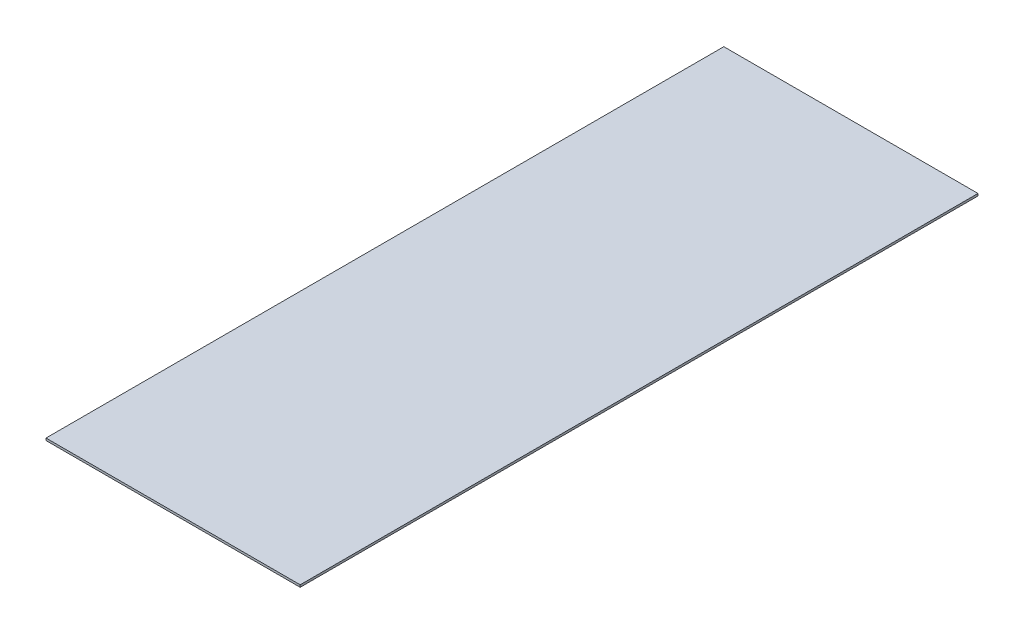
ISO-10303-21;
HEADER;
FILE_DESCRIPTION(('STEP AP214'),'2;1');
FILE_NAME('part.step','',(''),(''),'','','');
FILE_SCHEMA(('AUTOMOTIVE_DESIGN { 1 0 10303 214 1 1 1 1 }'));
ENDSEC;
DATA;
#1=APPLICATION_CONTEXT('core data for automotive mechanical design processes');
#2=APPLICATION_PROTOCOL_DEFINITION('international standard','automotive_design',2000,#1);
#3=PRODUCT_CONTEXT('',#1,'mechanical');
#4=PRODUCT('Part','Part','',(#3));
#5=PRODUCT_RELATED_PRODUCT_CATEGORY('part','',(#4));
#6=PRODUCT_DEFINITION_FORMATION('','',#4);
#7=PRODUCT_DEFINITION_CONTEXT('part definition',#1,'design');
#8=PRODUCT_DEFINITION('design','',#6,#7);
#9=PRODUCT_DEFINITION_SHAPE('','',#8);
#10=(LENGTH_UNIT() NAMED_UNIT(*) SI_UNIT(.MILLI.,.METRE.));
#11=(NAMED_UNIT(*) PLANE_ANGLE_UNIT() SI_UNIT($,.RADIAN.));
#12=(NAMED_UNIT(*) SI_UNIT($,.STERADIAN.) SOLID_ANGLE_UNIT());
#13=UNCERTAINTY_MEASURE_WITH_UNIT(LENGTH_MEASURE(1.E-05),#10,'distance_accuracy_value','');
#14=(GEOMETRIC_REPRESENTATION_CONTEXT(3) GLOBAL_UNCERTAINTY_ASSIGNED_CONTEXT((#13)) GLOBAL_UNIT_ASSIGNED_CONTEXT((#10,
#11,#12)) REPRESENTATION_CONTEXT('',''));
#15=CARTESIAN_POINT('',(0.,0.,0.));
#16=DIRECTION('',(0.,0.,1.));
#17=DIRECTION('',(1.,0.,0.));
#18=AXIS2_PLACEMENT_3D('',#15,#16,#17);
#19=CARTESIAN_POINT('',(457.2,7.9,1219.2));
#20=DIRECTION('',(-1.,0.,0.));
#21=DIRECTION('',(0.,0.,1.));
#22=AXIS2_PLACEMENT_3D('',#19,#20,#21);
#23=PLANE('',#22);
#24=DIRECTION('',(0.,0.,-1.));
#25=VECTOR('',#24,1.);
#26=CARTESIAN_POINT('',(457.2,0.,1219.2));
#27=LINE('',#26,#25);
#28=CARTESIAN_POINT('',(457.2,0.,1219.2));
#29=VERTEX_POINT('',#28);
#30=CARTESIAN_POINT('',(457.2,0.,-1219.2));
#31=VERTEX_POINT('',#30);
#32=EDGE_CURVE('E96',#29,#31,#27,.T.);
#33=ORIENTED_EDGE('',*,*,#32,.T.);
#34=DIRECTION('',(0.,-1.,0.));
#35=VECTOR('',#34,1.);
#36=CARTESIAN_POINT('',(457.2,7.9,-1219.2));
#37=LINE('',#36,#35);
#38=CARTESIAN_POINT('',(457.2,7.9,-1219.2));
#39=VERTEX_POINT('',#38);
#40=EDGE_CURVE('E11',#39,#31,#37,.T.);
#41=ORIENTED_EDGE('',*,*,#40,.F.);
#42=DIRECTION('',(0.,0.,-1.));
#43=VECTOR('',#42,1.);
#44=CARTESIAN_POINT('',(457.2,7.9,1219.2));
#45=LINE('',#44,#43);
#46=CARTESIAN_POINT('',(457.2,7.9,1219.2));
#47=VERTEX_POINT('',#46);
#48=EDGE_CURVE('E84',#47,#39,#45,.T.);
#49=ORIENTED_EDGE('',*,*,#48,.F.);
#50=DIRECTION('',(0.,-1.,0.));
#51=VECTOR('',#50,1.);
#52=CARTESIAN_POINT('',(457.2,7.9,1219.2));
#53=LINE('',#52,#51);
#54=EDGE_CURVE('E92',#47,#29,#53,.T.);
#55=ORIENTED_EDGE('',*,*,#54,.T.);
#56=EDGE_LOOP('',(#33,#41,#49,#55));
#57=FACE_BOUND('',#56,.T.);
#58=ADVANCED_FACE('F33',(#57),#23,.F.);
#59=CARTESIAN_POINT('',(-457.2,7.9,-1219.2));
#60=DIRECTION('',(0.,0.,1.));
#61=DIRECTION('',(1.,0.,0.));
#62=AXIS2_PLACEMENT_3D('',#59,#60,#61);
#63=PLANE('',#62);
#64=DIRECTION('',(-1.,0.,0.));
#65=VECTOR('',#64,1.);
#66=CARTESIAN_POINT('',(-457.2,0.,-1219.2));
#67=LINE('',#66,#65);
#68=CARTESIAN_POINT('',(-457.2,0.,-1219.2));
#69=VERTEX_POINT('',#68);
#70=EDGE_CURVE('E88',#31,#69,#67,.T.);
#71=ORIENTED_EDGE('',*,*,#70,.T.);
#72=DIRECTION('',(0.,-1.,0.));
#73=VECTOR('',#72,1.);
#74=CARTESIAN_POINT('',(-457.2,7.9,-1219.2));
#75=LINE('',#74,#73);
#76=CARTESIAN_POINT('',(-457.2,7.9,-1219.2));
#77=VERTEX_POINT('',#76);
#78=EDGE_CURVE('E41',#77,#69,#75,.T.);
#79=ORIENTED_EDGE('',*,*,#78,.F.);
#80=DIRECTION('',(-1.,0.,0.));
#81=VECTOR('',#80,1.);
#82=CARTESIAN_POINT('',(-457.2,7.9,-1219.2));
#83=LINE('',#82,#81);
#84=EDGE_CURVE('E79',#39,#77,#83,.T.);
#85=ORIENTED_EDGE('',*,*,#84,.F.);
#86=ORIENTED_EDGE('',*,*,#40,.T.);
#87=EDGE_LOOP('',(#71,#79,#85,#86));
#88=FACE_BOUND('',#87,.T.);
#89=ADVANCED_FACE('F87',(#88),#63,.F.);
#90=CARTESIAN_POINT('',(-457.2,7.9,1219.2));
#91=DIRECTION('',(1.,0.,0.));
#92=DIRECTION('',(0.,0.,-1.));
#93=AXIS2_PLACEMENT_3D('',#90,#91,#92);
#94=PLANE('',#93);
#95=DIRECTION('',(0.,0.,1.));
#96=VECTOR('',#95,1.);
#97=CARTESIAN_POINT('',(-457.2,0.,1219.2));
#98=LINE('',#97,#96);
#99=CARTESIAN_POINT('',(-457.2,0.,1219.2));
#100=VERTEX_POINT('',#99);
#101=EDGE_CURVE('E66',#69,#100,#98,.T.);
#102=ORIENTED_EDGE('',*,*,#101,.T.);
#103=DIRECTION('',(0.,-1.,0.));
#104=VECTOR('',#103,1.);
#105=CARTESIAN_POINT('',(-457.2,7.9,1219.2));
#106=LINE('',#105,#104);
#107=CARTESIAN_POINT('',(-457.2,7.9,1219.2));
#108=VERTEX_POINT('',#107);
#109=EDGE_CURVE('E89',#108,#100,#106,.T.);
#110=ORIENTED_EDGE('',*,*,#109,.F.);
#111=DIRECTION('',(0.,0.,1.));
#112=VECTOR('',#111,1.);
#113=CARTESIAN_POINT('',(-457.2,7.9,1219.2));
#114=LINE('',#113,#112);
#115=EDGE_CURVE('E82',#77,#108,#114,.T.);
#116=ORIENTED_EDGE('',*,*,#115,.F.);
#117=ORIENTED_EDGE('',*,*,#78,.T.);
#118=EDGE_LOOP('',(#102,#110,#116,#117));
#119=FACE_BOUND('',#118,.T.);
#120=ADVANCED_FACE('F90',(#119),#94,.F.);
#121=CARTESIAN_POINT('',(-457.2,7.9,1219.2));
#122=DIRECTION('',(0.,0.,-1.));
#123=DIRECTION('',(-1.,0.,0.));
#124=AXIS2_PLACEMENT_3D('',#121,#122,#123);
#125=PLANE('',#124);
#126=DIRECTION('',(1.,0.,0.));
#127=VECTOR('',#126,1.);
#128=CARTESIAN_POINT('',(-457.2,0.,1219.2));
#129=LINE('',#128,#127);
#130=EDGE_CURVE('E72',#100,#29,#129,.T.);
#131=ORIENTED_EDGE('',*,*,#130,.T.);
#132=ORIENTED_EDGE('',*,*,#54,.F.);
#133=DIRECTION('',(1.,0.,0.));
#134=VECTOR('',#133,1.);
#135=CARTESIAN_POINT('',(-457.2,7.9,1219.2));
#136=LINE('',#135,#134);
#137=EDGE_CURVE('E49',#108,#47,#136,.T.);
#138=ORIENTED_EDGE('',*,*,#137,.F.);
#139=ORIENTED_EDGE('',*,*,#109,.T.);
#140=EDGE_LOOP('',(#131,#132,#138,#139));
#141=FACE_BOUND('',#140,.T.);
#142=ADVANCED_FACE('F103',(#141),#125,.F.);
#143=CARTESIAN_POINT('',(0.,7.9,0.));
#144=DIRECTION('',(0.,-1.,0.));
#145=DIRECTION('',(0.,0.,-1.));
#146=AXIS2_PLACEMENT_3D('',#143,#144,#145);
#147=PLANE('',#146);
#148=ORIENTED_EDGE('',*,*,#48,.T.);
#149=ORIENTED_EDGE('',*,*,#84,.T.);
#150=ORIENTED_EDGE('',*,*,#115,.T.);
#151=ORIENTED_EDGE('',*,*,#137,.T.);
#152=EDGE_LOOP('',(#148,#149,#150,#151));
#153=FACE_BOUND('',#152,.T.);
#154=ADVANCED_FACE('F80',(#153),#147,.F.);
#155=CARTESIAN_POINT('',(0.,0.,0.));
#156=DIRECTION('',(0.,-1.,0.));
#157=DIRECTION('',(0.,0.,-1.));
#158=AXIS2_PLACEMENT_3D('',#155,#156,#157);
#159=PLANE('',#158);
#160=ORIENTED_EDGE('',*,*,#32,.F.);
#161=ORIENTED_EDGE('',*,*,#130,.F.);
#162=ORIENTED_EDGE('',*,*,#101,.F.);
#163=ORIENTED_EDGE('',*,*,#70,.F.);
#164=EDGE_LOOP('',(#160,#161,#162,#163));
#165=FACE_BOUND('',#164,.T.);
#166=ADVANCED_FACE('F106',(#165),#159,.T.);
#167=CLOSED_SHELL('',(#58,#89,#120,#142,#154,#166));
#168=MANIFOLD_SOLID_BREP('B2',#167);
#169=ADVANCED_BREP_SHAPE_REPRESENTATION('',(#18,#168),#14);
#170=SHAPE_DEFINITION_REPRESENTATION(#9,#169);
ENDSEC;
END-ISO-10303-21;
